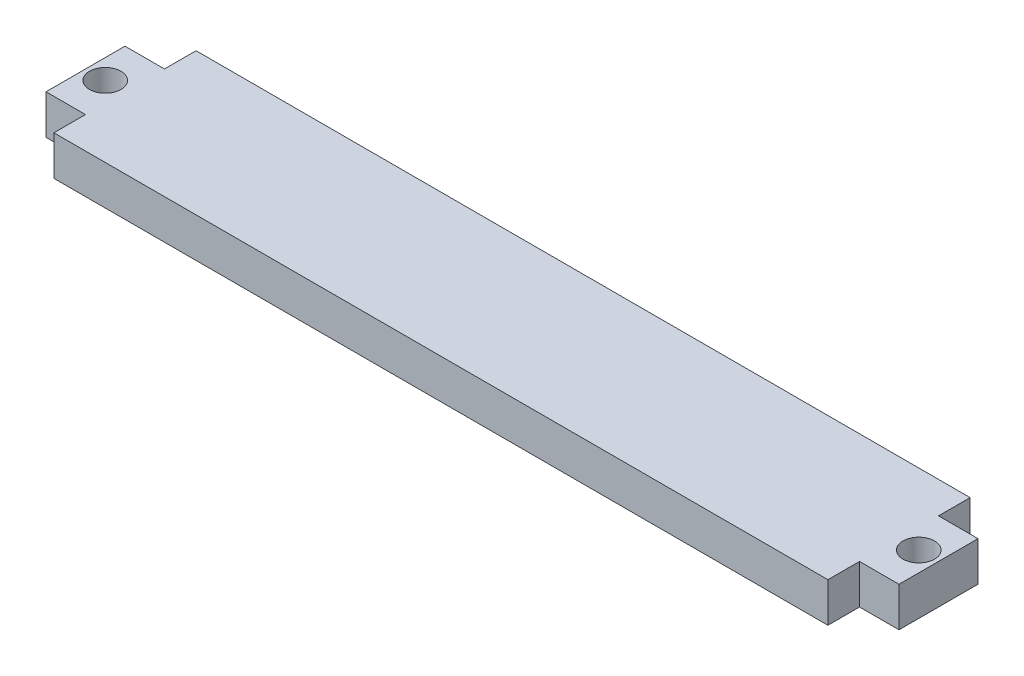
ISO-10303-21;
HEADER;
FILE_DESCRIPTION(('STEP AP214'),'2;1');
FILE_NAME('part.step','',(''),(''),'','','');
FILE_SCHEMA(('AUTOMOTIVE_DESIGN { 1 0 10303 214 1 1 1 1 }'));
ENDSEC;
DATA;
#1=APPLICATION_CONTEXT('core data for automotive mechanical design processes');
#2=APPLICATION_PROTOCOL_DEFINITION('international standard','automotive_design',2000,#1);
#3=PRODUCT_CONTEXT('',#1,'mechanical');
#4=PRODUCT('Part','Part','',(#3));
#5=PRODUCT_RELATED_PRODUCT_CATEGORY('part','',(#4));
#6=PRODUCT_DEFINITION_FORMATION('','',#4);
#7=PRODUCT_DEFINITION_CONTEXT('part definition',#1,'design');
#8=PRODUCT_DEFINITION('design','',#6,#7);
#9=PRODUCT_DEFINITION_SHAPE('','',#8);
#10=(LENGTH_UNIT() NAMED_UNIT(*) SI_UNIT(.MILLI.,.METRE.));
#11=(NAMED_UNIT(*) PLANE_ANGLE_UNIT() SI_UNIT($,.RADIAN.));
#12=(NAMED_UNIT(*) SI_UNIT($,.STERADIAN.) SOLID_ANGLE_UNIT());
#13=UNCERTAINTY_MEASURE_WITH_UNIT(LENGTH_MEASURE(1.E-05),#10,'distance_accuracy_value','');
#14=(GEOMETRIC_REPRESENTATION_CONTEXT(3) GLOBAL_UNCERTAINTY_ASSIGNED_CONTEXT((#13)) GLOBAL_UNIT_ASSIGNED_CONTEXT((#10,
#11,#12)) REPRESENTATION_CONTEXT('',''));
#15=CARTESIAN_POINT('',(0.,0.,0.));
#16=DIRECTION('',(0.,0.,1.));
#17=DIRECTION('',(1.,0.,0.));
#18=AXIS2_PLACEMENT_3D('',#15,#16,#17);
#19=CARTESIAN_POINT('',(-53.8737727910238,5.,0.));
#20=DIRECTION('',(1.,0.,0.));
#21=DIRECTION('',(0.,0.,-1.));
#22=AXIS2_PLACEMENT_3D('',#19,#20,#21);
#23=PLANE('',#22);
#24=DIRECTION('',(0.,0.,1.));
#25=VECTOR('',#24,1.);
#26=CARTESIAN_POINT('',(-53.8737727910238,0.,0.));
#27=LINE('',#26,#25);
#28=CARTESIAN_POINT('',(-53.8737727910238,0.,-13.0322580645161));
#29=VERTEX_POINT('',#28);
#30=CARTESIAN_POINT('',(-53.8737727910238,0.,-3.03225806451611));
#31=VERTEX_POINT('',#30);
#32=EDGE_CURVE('E162',#29,#31,#27,.T.);
#33=ORIENTED_EDGE('',*,*,#32,.T.);
#34=DIRECTION('',(0.,-1.,0.));
#35=VECTOR('',#34,1.);
#36=CARTESIAN_POINT('',(-53.8737727910238,5.,-3.03225806451611));
#37=LINE('',#36,#35);
#38=CARTESIAN_POINT('',(-53.8737727910238,5.,-3.03225806451611));
#39=VERTEX_POINT('',#38);
#40=EDGE_CURVE('E11',#39,#31,#37,.T.);
#41=ORIENTED_EDGE('',*,*,#40,.F.);
#42=DIRECTION('',(0.,0.,1.));
#43=VECTOR('',#42,1.);
#44=CARTESIAN_POINT('',(-53.8737727910238,5.,0.));
#45=LINE('',#44,#43);
#46=CARTESIAN_POINT('',(-53.8737727910238,5.,-13.0322580645161));
#47=VERTEX_POINT('',#46);
#48=EDGE_CURVE('E199',#47,#39,#45,.T.);
#49=ORIENTED_EDGE('',*,*,#48,.F.);
#50=DIRECTION('',(0.,-1.,0.));
#51=VECTOR('',#50,1.);
#52=CARTESIAN_POINT('',(-53.8737727910238,5.,-13.0322580645161));
#53=LINE('',#52,#51);
#54=EDGE_CURVE('E49',#47,#29,#53,.T.);
#55=ORIENTED_EDGE('',*,*,#54,.T.);
#56=EDGE_LOOP('',(#33,#41,#49,#55));
#57=FACE_BOUND('',#56,.T.);
#58=ADVANCED_FACE('F33',(#57),#23,.F.);
#59=CARTESIAN_POINT('',(0.,5.,-3.03225806451616));
#60=DIRECTION('',(0.,0.,-1.));
#61=DIRECTION('',(-1.,0.,0.));
#62=AXIS2_PLACEMENT_3D('',#59,#60,#61);
#63=PLANE('',#62);
#64=DIRECTION('',(1.,0.,0.));
#65=VECTOR('',#64,1.);
#66=CARTESIAN_POINT('',(0.,0.,-3.03225806451616));
#67=LINE('',#66,#65);
#68=CARTESIAN_POINT('',(-48.8737727910238,0.,-3.03225806451611));
#69=VERTEX_POINT('',#68);
#70=EDGE_CURVE('E164',#31,#69,#67,.T.);
#71=ORIENTED_EDGE('',*,*,#70,.T.);
#72=DIRECTION('',(0.,-1.,0.));
#73=VECTOR('',#72,1.);
#74=CARTESIAN_POINT('',(-48.8737727910238,5.,-3.03225806451611));
#75=LINE('',#74,#73);
#76=CARTESIAN_POINT('',(-48.8737727910238,5.,-3.03225806451611));
#77=VERTEX_POINT('',#76);
#78=EDGE_CURVE('E41',#77,#69,#75,.T.);
#79=ORIENTED_EDGE('',*,*,#78,.F.);
#80=DIRECTION('',(1.,0.,0.));
#81=VECTOR('',#80,1.);
#82=CARTESIAN_POINT('',(0.,5.,-3.03225806451616));
#83=LINE('',#82,#81);
#84=EDGE_CURVE('E100',#39,#77,#83,.T.);
#85=ORIENTED_EDGE('',*,*,#84,.F.);
#86=ORIENTED_EDGE('',*,*,#40,.T.);
#87=EDGE_LOOP('',(#71,#79,#85,#86));
#88=FACE_BOUND('',#87,.T.);
#89=ADVANCED_FACE('F221',(#88),#63,.F.);
#90=CARTESIAN_POINT('',(-48.8737727910238,5.,0.));
#91=DIRECTION('',(-1.,0.,0.));
#92=DIRECTION('',(0.,0.,1.));
#93=AXIS2_PLACEMENT_3D('',#90,#91,#92);
#94=PLANE('',#93);
#95=DIRECTION('',(0.,0.,-1.));
#96=VECTOR('',#95,1.);
#97=CARTESIAN_POINT('',(-48.8737727910238,0.,0.));
#98=LINE('',#97,#96);
#99=CARTESIAN_POINT('',(-48.8737727910238,0.,0.967741935483895));
#100=VERTEX_POINT('',#99);
#101=EDGE_CURVE('E167',#100,#69,#98,.T.);
#102=ORIENTED_EDGE('',*,*,#101,.F.);
#103=DIRECTION('',(0.,-1.,0.));
#104=VECTOR('',#103,1.);
#105=CARTESIAN_POINT('',(-48.8737727910238,5.,0.967741935483895));
#106=LINE('',#105,#104);
#107=CARTESIAN_POINT('',(-48.8737727910238,5.,0.967741935483895));
#108=VERTEX_POINT('',#107);
#109=EDGE_CURVE('E214',#108,#100,#106,.T.);
#110=ORIENTED_EDGE('',*,*,#109,.F.);
#111=DIRECTION('',(0.,0.,-1.));
#112=VECTOR('',#111,1.);
#113=CARTESIAN_POINT('',(-48.8737727910238,5.,0.));
#114=LINE('',#113,#112);
#115=EDGE_CURVE('E220',#108,#77,#114,.T.);
#116=ORIENTED_EDGE('',*,*,#115,.T.);
#117=ORIENTED_EDGE('',*,*,#78,.T.);
#118=EDGE_LOOP('',(#102,#110,#116,#117));
#119=FACE_BOUND('',#118,.T.);
#120=ADVANCED_FACE('F218',(#119),#94,.T.);
#121=CARTESIAN_POINT('',(0.,5.,0.967741935483895));
#122=DIRECTION('',(0.,0.,-1.));
#123=DIRECTION('',(-1.,0.,0.));
#124=AXIS2_PLACEMENT_3D('',#121,#122,#123);
#125=PLANE('',#124);
#126=DIRECTION('',(1.,0.,0.));
#127=VECTOR('',#126,1.);
#128=CARTESIAN_POINT('',(0.,0.,0.967741935483895));
#129=LINE('',#128,#127);
#130=CARTESIAN_POINT('',(49.1262272089762,0.,0.967741935483895));
#131=VERTEX_POINT('',#130);
#132=EDGE_CURVE('E170',#100,#131,#129,.T.);
#133=ORIENTED_EDGE('',*,*,#132,.T.);
#134=DIRECTION('',(0.,-1.,0.));
#135=VECTOR('',#134,1.);
#136=CARTESIAN_POINT('',(49.1262272089762,5.,0.967741935483895));
#137=LINE('',#136,#135);
#138=CARTESIAN_POINT('',(49.1262272089762,5.,0.967741935483895));
#139=VERTEX_POINT('',#138);
#140=EDGE_CURVE('E211',#139,#131,#137,.T.);
#141=ORIENTED_EDGE('',*,*,#140,.F.);
#142=DIRECTION('',(1.,0.,0.));
#143=VECTOR('',#142,1.);
#144=CARTESIAN_POINT('',(0.,5.,0.967741935483895));
#145=LINE('',#144,#143);
#146=EDGE_CURVE('E240',#108,#139,#145,.T.);
#147=ORIENTED_EDGE('',*,*,#146,.F.);
#148=ORIENTED_EDGE('',*,*,#109,.T.);
#149=EDGE_LOOP('',(#133,#141,#147,#148));
#150=FACE_BOUND('',#149,.T.);
#151=ADVANCED_FACE('F230',(#150),#125,.F.);
#152=CARTESIAN_POINT('',(49.1262272089762,5.,0.));
#153=DIRECTION('',(-1.,0.,0.));
#154=DIRECTION('',(0.,0.,1.));
#155=AXIS2_PLACEMENT_3D('',#152,#153,#154);
#156=PLANE('',#155);
#157=DIRECTION('',(0.,0.,-1.));
#158=VECTOR('',#157,1.);
#159=CARTESIAN_POINT('',(49.1262272089762,0.,0.));
#160=LINE('',#159,#158);
#161=CARTESIAN_POINT('',(49.1262272089762,0.,-3.0322580645161));
#162=VERTEX_POINT('',#161);
#163=EDGE_CURVE('E172',#131,#162,#160,.T.);
#164=ORIENTED_EDGE('',*,*,#163,.T.);
#165=DIRECTION('',(0.,-1.,0.));
#166=VECTOR('',#165,1.);
#167=CARTESIAN_POINT('',(49.1262272089762,5.,-3.0322580645161));
#168=LINE('',#167,#166);
#169=CARTESIAN_POINT('',(49.1262272089762,5.,-3.0322580645161));
#170=VERTEX_POINT('',#169);
#171=EDGE_CURVE('E209',#170,#162,#168,.T.);
#172=ORIENTED_EDGE('',*,*,#171,.F.);
#173=DIRECTION('',(0.,0.,-1.));
#174=VECTOR('',#173,1.);
#175=CARTESIAN_POINT('',(49.1262272089762,5.,0.));
#176=LINE('',#175,#174);
#177=EDGE_CURVE('E236',#139,#170,#176,.T.);
#178=ORIENTED_EDGE('',*,*,#177,.F.);
#179=ORIENTED_EDGE('',*,*,#140,.T.);
#180=EDGE_LOOP('',(#164,#172,#178,#179));
#181=FACE_BOUND('',#180,.T.);
#182=ADVANCED_FACE('F234',(#181),#156,.F.);
#183=CARTESIAN_POINT('',(0.,5.,-3.0322580645161));
#184=DIRECTION('',(0.,0.,1.));
#185=DIRECTION('',(1.,0.,0.));
#186=AXIS2_PLACEMENT_3D('',#183,#184,#185);
#187=PLANE('',#186);
#188=DIRECTION('',(-1.,0.,0.));
#189=VECTOR('',#188,1.);
#190=CARTESIAN_POINT('',(0.,0.,-3.0322580645161));
#191=LINE('',#190,#189);
#192=CARTESIAN_POINT('',(54.1262272089762,0.,-3.0322580645161));
#193=VERTEX_POINT('',#192);
#194=EDGE_CURVE('E175',#193,#162,#191,.T.);
#195=ORIENTED_EDGE('',*,*,#194,.F.);
#196=DIRECTION('',(0.,-1.,0.));
#197=VECTOR('',#196,1.);
#198=CARTESIAN_POINT('',(54.1262272089762,5.,-3.0322580645161));
#199=LINE('',#198,#197);
#200=CARTESIAN_POINT('',(54.1262272089762,5.,-3.0322580645161));
#201=VERTEX_POINT('',#200);
#202=EDGE_CURVE('E207',#201,#193,#199,.T.);
#203=ORIENTED_EDGE('',*,*,#202,.F.);
#204=DIRECTION('',(-1.,0.,0.));
#205=VECTOR('',#204,1.);
#206=CARTESIAN_POINT('',(0.,5.,-3.0322580645161));
#207=LINE('',#206,#205);
#208=EDGE_CURVE('E239',#201,#170,#207,.T.);
#209=ORIENTED_EDGE('',*,*,#208,.T.);
#210=ORIENTED_EDGE('',*,*,#171,.T.);
#211=EDGE_LOOP('',(#195,#203,#209,#210));
#212=FACE_BOUND('',#211,.T.);
#213=ADVANCED_FACE('F286',(#212),#187,.T.);
#214=CARTESIAN_POINT('',(54.1262272089762,5.,0.));
#215=DIRECTION('',(1.,0.,0.));
#216=DIRECTION('',(0.,0.,-1.));
#217=AXIS2_PLACEMENT_3D('',#214,#215,#216);
#218=PLANE('',#217);
#219=DIRECTION('',(0.,0.,1.));
#220=VECTOR('',#219,1.);
#221=CARTESIAN_POINT('',(54.1262272089762,0.,0.));
#222=LINE('',#221,#220);
#223=CARTESIAN_POINT('',(54.1262272089762,0.,-13.0322580645161));
#224=VERTEX_POINT('',#223);
#225=EDGE_CURVE('E178',#224,#193,#222,.T.);
#226=ORIENTED_EDGE('',*,*,#225,.F.);
#227=DIRECTION('',(0.,-1.,0.));
#228=VECTOR('',#227,1.);
#229=CARTESIAN_POINT('',(54.1262272089762,5.,-13.0322580645161));
#230=LINE('',#229,#228);
#231=CARTESIAN_POINT('',(54.1262272089762,5.,-13.0322580645161));
#232=VERTEX_POINT('',#231);
#233=EDGE_CURVE('E205',#232,#224,#230,.T.);
#234=ORIENTED_EDGE('',*,*,#233,.F.);
#235=DIRECTION('',(0.,0.,1.));
#236=VECTOR('',#235,1.);
#237=CARTESIAN_POINT('',(54.1262272089762,5.,0.));
#238=LINE('',#237,#236);
#239=EDGE_CURVE('E242',#232,#201,#238,.T.);
#240=ORIENTED_EDGE('',*,*,#239,.T.);
#241=ORIENTED_EDGE('',*,*,#202,.T.);
#242=EDGE_LOOP('',(#226,#234,#240,#241));
#243=FACE_BOUND('',#242,.T.);
#244=ADVANCED_FACE('F289',(#243),#218,.T.);
#245=CARTESIAN_POINT('',(0.,5.,-13.0322580645161));
#246=DIRECTION('',(0.,0.,1.));
#247=DIRECTION('',(1.,0.,0.));
#248=AXIS2_PLACEMENT_3D('',#245,#246,#247);
#249=PLANE('',#248);
#250=DIRECTION('',(-1.,0.,0.));
#251=VECTOR('',#250,1.);
#252=CARTESIAN_POINT('',(0.,0.,-13.0322580645161));
#253=LINE('',#252,#251);
#254=CARTESIAN_POINT('',(49.1262272089762,0.,-13.0322580645161));
#255=VERTEX_POINT('',#254);
#256=EDGE_CURVE('E181',#224,#255,#253,.T.);
#257=ORIENTED_EDGE('',*,*,#256,.T.);
#258=DIRECTION('',(0.,-1.,0.));
#259=VECTOR('',#258,1.);
#260=CARTESIAN_POINT('',(49.1262272089762,5.,-13.0322580645161));
#261=LINE('',#260,#259);
#262=CARTESIAN_POINT('',(49.1262272089762,5.,-13.0322580645161));
#263=VERTEX_POINT('',#262);
#264=EDGE_CURVE('E203',#263,#255,#261,.T.);
#265=ORIENTED_EDGE('',*,*,#264,.F.);
#266=DIRECTION('',(-1.,0.,0.));
#267=VECTOR('',#266,1.);
#268=CARTESIAN_POINT('',(0.,5.,-13.0322580645161));
#269=LINE('',#268,#267);
#270=EDGE_CURVE('E151',#232,#263,#269,.T.);
#271=ORIENTED_EDGE('',*,*,#270,.F.);
#272=ORIENTED_EDGE('',*,*,#233,.T.);
#273=EDGE_LOOP('',(#257,#265,#271,#272));
#274=FACE_BOUND('',#273,.T.);
#275=ADVANCED_FACE('F252',(#274),#249,.F.);
#276=CARTESIAN_POINT('',(49.1262272089762,5.,0.));
#277=DIRECTION('',(1.,0.,0.));
#278=DIRECTION('',(0.,0.,-1.));
#279=AXIS2_PLACEMENT_3D('',#276,#277,#278);
#280=PLANE('',#279);
#281=DIRECTION('',(0.,0.,1.));
#282=VECTOR('',#281,1.);
#283=CARTESIAN_POINT('',(49.1262272089762,0.,0.));
#284=LINE('',#283,#282);
#285=CARTESIAN_POINT('',(49.1262272089762,0.,-17.0322580645161));
#286=VERTEX_POINT('',#285);
#287=EDGE_CURVE('E184',#286,#255,#284,.T.);
#288=ORIENTED_EDGE('',*,*,#287,.F.);
#289=DIRECTION('',(0.,-1.,0.));
#290=VECTOR('',#289,1.);
#291=CARTESIAN_POINT('',(49.1262272089762,5.,-17.0322580645161));
#292=LINE('',#291,#290);
#293=CARTESIAN_POINT('',(49.1262272089762,5.,-17.0322580645161));
#294=VERTEX_POINT('',#293);
#295=EDGE_CURVE('E137',#294,#286,#292,.T.);
#296=ORIENTED_EDGE('',*,*,#295,.F.);
#297=DIRECTION('',(0.,0.,1.));
#298=VECTOR('',#297,1.);
#299=CARTESIAN_POINT('',(49.1262272089762,5.,0.));
#300=LINE('',#299,#298);
#301=EDGE_CURVE('E149',#294,#263,#300,.T.);
#302=ORIENTED_EDGE('',*,*,#301,.T.);
#303=ORIENTED_EDGE('',*,*,#264,.T.);
#304=EDGE_LOOP('',(#288,#296,#302,#303));
#305=FACE_BOUND('',#304,.T.);
#306=ADVANCED_FACE('F256',(#305),#280,.T.);
#307=CARTESIAN_POINT('',(0.,5.,-17.0322580645161));
#308=DIRECTION('',(0.,0.,-1.));
#309=DIRECTION('',(-1.,0.,0.));
#310=AXIS2_PLACEMENT_3D('',#307,#308,#309);
#311=PLANE('',#310);
#312=DIRECTION('',(1.,0.,0.));
#313=VECTOR('',#312,1.);
#314=CARTESIAN_POINT('',(0.,0.,-17.0322580645161));
#315=LINE('',#314,#313);
#316=CARTESIAN_POINT('',(-48.8737727910238,0.,-17.0322580645161));
#317=VERTEX_POINT('',#316);
#318=EDGE_CURVE('E134',#317,#286,#315,.T.);
#319=ORIENTED_EDGE('',*,*,#318,.F.);
#320=DIRECTION('',(0.,-1.,0.));
#321=VECTOR('',#320,1.);
#322=CARTESIAN_POINT('',(-48.8737727910238,5.,-17.0322580645161));
#323=LINE('',#322,#321);
#324=CARTESIAN_POINT('',(-48.8737727910238,5.,-17.0322580645161));
#325=VERTEX_POINT('',#324);
#326=EDGE_CURVE('E128',#325,#317,#323,.T.);
#327=ORIENTED_EDGE('',*,*,#326,.F.);
#328=DIRECTION('',(1.,0.,0.));
#329=VECTOR('',#328,1.);
#330=CARTESIAN_POINT('',(0.,5.,-17.0322580645161));
#331=LINE('',#330,#329);
#332=EDGE_CURVE('E132',#325,#294,#331,.T.);
#333=ORIENTED_EDGE('',*,*,#332,.T.);
#334=ORIENTED_EDGE('',*,*,#295,.T.);
#335=EDGE_LOOP('',(#319,#327,#333,#334));
#336=FACE_BOUND('',#335,.T.);
#337=ADVANCED_FACE('F130',(#336),#311,.T.);
#338=CARTESIAN_POINT('',(-48.8737727910238,5.,0.));
#339=DIRECTION('',(1.,0.,0.));
#340=DIRECTION('',(0.,0.,-1.));
#341=AXIS2_PLACEMENT_3D('',#338,#339,#340);
#342=PLANE('',#341);
#343=DIRECTION('',(0.,0.,1.));
#344=VECTOR('',#343,1.);
#345=CARTESIAN_POINT('',(-48.8737727910238,0.,0.));
#346=LINE('',#345,#344);
#347=CARTESIAN_POINT('',(-48.8737727910238,0.,-13.0322580645161));
#348=VERTEX_POINT('',#347);
#349=EDGE_CURVE('E188',#317,#348,#346,.T.);
#350=ORIENTED_EDGE('',*,*,#349,.T.);
#351=DIRECTION('',(0.,-1.,0.));
#352=VECTOR('',#351,1.);
#353=CARTESIAN_POINT('',(-48.8737727910238,5.,-13.0322580645161));
#354=LINE('',#353,#352);
#355=CARTESIAN_POINT('',(-48.8737727910238,5.,-13.0322580645161));
#356=VERTEX_POINT('',#355);
#357=EDGE_CURVE('E88',#356,#348,#354,.T.);
#358=ORIENTED_EDGE('',*,*,#357,.F.);
#359=DIRECTION('',(0.,0.,1.));
#360=VECTOR('',#359,1.);
#361=CARTESIAN_POINT('',(-48.8737727910238,5.,0.));
#362=LINE('',#361,#360);
#363=EDGE_CURVE('E139',#325,#356,#362,.T.);
#364=ORIENTED_EDGE('',*,*,#363,.F.);
#365=ORIENTED_EDGE('',*,*,#326,.T.);
#366=EDGE_LOOP('',(#350,#358,#364,#365));
#367=FACE_BOUND('',#366,.T.);
#368=ADVANCED_FACE('F140',(#367),#342,.F.);
#369=CARTESIAN_POINT('',(51.6262272089762,5.,-8.0322580645161));
#370=DIRECTION('',(0.,-1.,0.));
#371=DIRECTION('',(0.,0.,-1.));
#372=AXIS2_PLACEMENT_3D('',#369,#370,#371);
#373=CYLINDRICAL_SURFACE('',#372,2.);
#374=CARTESIAN_POINT('',(51.6262272089762,5.,-8.0322580645161));
#375=DIRECTION('',(0.,1.,0.));
#376=DIRECTION('',(0.,0.,1.));
#377=AXIS2_PLACEMENT_3D('',#374,#375,#376);
#378=CIRCLE('',#377,2.);
#379=CARTESIAN_POINT('',(51.6262272089762,5.,-6.0322580645161));
#380=VERTEX_POINT('',#379);
#381=EDGE_CURVE('E156',#380,#380,#378,.T.);
#382=ORIENTED_EDGE('',*,*,#381,.T.);
#383=EDGE_LOOP('',(#382));
#384=FACE_BOUND('',#383,.T.);
#385=CARTESIAN_POINT('',(51.6262272089762,0.,-8.0322580645161));
#386=DIRECTION('',(0.,1.,0.));
#387=DIRECTION('',(0.,0.,1.));
#388=AXIS2_PLACEMENT_3D('',#385,#386,#387);
#389=CIRCLE('',#388,2.);
#390=CARTESIAN_POINT('',(51.6262272089762,0.,-6.0322580645161));
#391=VERTEX_POINT('',#390);
#392=EDGE_CURVE('E193',#391,#391,#389,.T.);
#393=ORIENTED_EDGE('',*,*,#392,.F.);
#394=EDGE_LOOP('',(#393));
#395=FACE_BOUND('',#394,.T.);
#396=ADVANCED_FACE('F260',(#384,#395),#373,.F.);
#397=CARTESIAN_POINT('',(0.,5.,-13.0322580645161));
#398=DIRECTION('',(0.,0.,-1.));
#399=DIRECTION('',(-1.,0.,0.));
#400=AXIS2_PLACEMENT_3D('',#397,#398,#399);
#401=PLANE('',#400);
#402=DIRECTION('',(1.,0.,0.));
#403=VECTOR('',#402,1.);
#404=CARTESIAN_POINT('',(0.,0.,-13.0322580645161));
#405=LINE('',#404,#403);
#406=EDGE_CURVE('E190',#29,#348,#405,.T.);
#407=ORIENTED_EDGE('',*,*,#406,.F.);
#408=ORIENTED_EDGE('',*,*,#54,.F.);
#409=DIRECTION('',(1.,0.,0.));
#410=VECTOR('',#409,1.);
#411=CARTESIAN_POINT('',(0.,5.,-13.0322580645161));
#412=LINE('',#411,#410);
#413=EDGE_CURVE('E143',#47,#356,#412,.T.);
#414=ORIENTED_EDGE('',*,*,#413,.T.);
#415=ORIENTED_EDGE('',*,*,#357,.T.);
#416=EDGE_LOOP('',(#407,#408,#414,#415));
#417=FACE_BOUND('',#416,.T.);
#418=ADVANCED_FACE('F257',(#417),#401,.T.);
#419=CARTESIAN_POINT('',(-51.3737727910238,5.,-8.03225806451611));
#420=DIRECTION('',(0.,-1.,0.));
#421=DIRECTION('',(0.,0.,-1.));
#422=AXIS2_PLACEMENT_3D('',#419,#420,#421);
#423=CYLINDRICAL_SURFACE('',#422,2.);
#424=CARTESIAN_POINT('',(-51.3737727910238,5.,-8.03225806451611));
#425=DIRECTION('',(0.,1.,0.));
#426=DIRECTION('',(0.,0.,1.));
#427=AXIS2_PLACEMENT_3D('',#424,#425,#426);
#428=CIRCLE('',#427,2.);
#429=CARTESIAN_POINT('',(-51.3737727910238,5.,-6.0322580645161));
#430=VERTEX_POINT('',#429);
#431=EDGE_CURVE('E159',#430,#430,#428,.F.);
#432=ORIENTED_EDGE('',*,*,#431,.F.);
#433=EDGE_LOOP('',(#432));
#434=FACE_BOUND('',#433,.T.);
#435=CARTESIAN_POINT('',(-51.3737727910238,0.,-8.03225806451611));
#436=DIRECTION('',(0.,1.,0.));
#437=DIRECTION('',(0.,0.,1.));
#438=AXIS2_PLACEMENT_3D('',#435,#436,#437);
#439=CIRCLE('',#438,2.);
#440=CARTESIAN_POINT('',(-51.3737727910238,0.,-6.0322580645161));
#441=VERTEX_POINT('',#440);
#442=EDGE_CURVE('E196',#441,#441,#439,.F.);
#443=ORIENTED_EDGE('',*,*,#442,.T.);
#444=EDGE_LOOP('',(#443));
#445=FACE_BOUND('',#444,.T.);
#446=ADVANCED_FACE('F259',(#434,#445),#423,.F.);
#447=CARTESIAN_POINT('',(0.,5.,0.));
#448=DIRECTION('',(0.,1.,0.));
#449=DIRECTION('',(0.,0.,1.));
#450=AXIS2_PLACEMENT_3D('',#447,#448,#449);
#451=PLANE('',#450);
#452=ORIENTED_EDGE('',*,*,#48,.T.);
#453=ORIENTED_EDGE('',*,*,#84,.T.);
#454=ORIENTED_EDGE('',*,*,#115,.F.);
#455=ORIENTED_EDGE('',*,*,#146,.T.);
#456=ORIENTED_EDGE('',*,*,#177,.T.);
#457=ORIENTED_EDGE('',*,*,#208,.F.);
#458=ORIENTED_EDGE('',*,*,#239,.F.);
#459=ORIENTED_EDGE('',*,*,#270,.T.);
#460=ORIENTED_EDGE('',*,*,#301,.F.);
#461=ORIENTED_EDGE('',*,*,#332,.F.);
#462=ORIENTED_EDGE('',*,*,#363,.T.);
#463=ORIENTED_EDGE('',*,*,#413,.F.);
#464=EDGE_LOOP('',(#452,#453,#454,#455,#456,#457,#458,#459,#460,#461,#462,#463));
#465=FACE_BOUND('',#464,.T.);
#466=ORIENTED_EDGE('',*,*,#381,.F.);
#467=EDGE_LOOP('',(#466));
#468=FACE_BOUND('',#467,.T.);
#469=ORIENTED_EDGE('',*,*,#431,.T.);
#470=EDGE_LOOP('',(#469));
#471=FACE_BOUND('',#470,.T.);
#472=ADVANCED_FACE('F146',(#465,#468,#471),#451,.T.);
#473=CARTESIAN_POINT('',(0.,0.,0.));
#474=DIRECTION('',(0.,1.,0.));
#475=DIRECTION('',(0.,0.,1.));
#476=AXIS2_PLACEMENT_3D('',#473,#474,#475);
#477=PLANE('',#476);
#478=ORIENTED_EDGE('',*,*,#32,.F.);
#479=ORIENTED_EDGE('',*,*,#406,.T.);
#480=ORIENTED_EDGE('',*,*,#349,.F.);
#481=ORIENTED_EDGE('',*,*,#318,.T.);
#482=ORIENTED_EDGE('',*,*,#287,.T.);
#483=ORIENTED_EDGE('',*,*,#256,.F.);
#484=ORIENTED_EDGE('',*,*,#225,.T.);
#485=ORIENTED_EDGE('',*,*,#194,.T.);
#486=ORIENTED_EDGE('',*,*,#163,.F.);
#487=ORIENTED_EDGE('',*,*,#132,.F.);
#488=ORIENTED_EDGE('',*,*,#101,.T.);
#489=ORIENTED_EDGE('',*,*,#70,.F.);
#490=EDGE_LOOP('',(#478,#479,#480,#481,#482,#483,#484,#485,#486,#487,#488,#489));
#491=FACE_BOUND('',#490,.T.);
#492=ORIENTED_EDGE('',*,*,#392,.T.);
#493=EDGE_LOOP('',(#492));
#494=FACE_BOUND('',#493,.T.);
#495=ORIENTED_EDGE('',*,*,#442,.F.);
#496=EDGE_LOOP('',(#495));
#497=FACE_BOUND('',#496,.T.);
#498=ADVANCED_FACE('F225',(#491,#494,#497),#477,.F.);
#499=CLOSED_SHELL('',(#58,#89,#120,#151,#182,#213,#244,#275,#306,#337,#368,#396,#418,#446,#472,#498));
#500=MANIFOLD_SOLID_BREP('B2',#499);
#501=ADVANCED_BREP_SHAPE_REPRESENTATION('',(#18,#500),#14);
#502=SHAPE_DEFINITION_REPRESENTATION(#9,#501);
ENDSEC;
END-ISO-10303-21;
